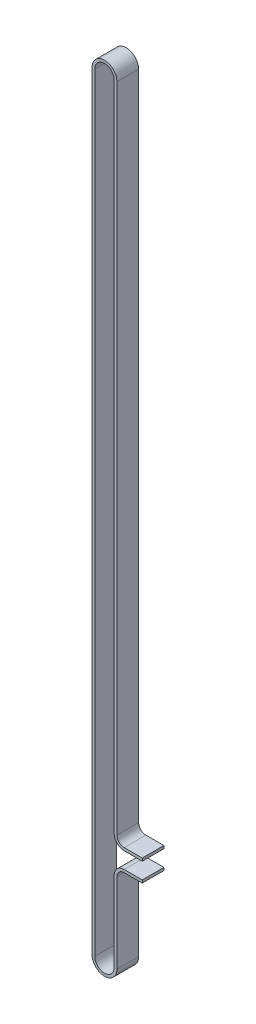
ISO-10303-21;
HEADER;
FILE_DESCRIPTION(('STEP AP214'),'2;1');
FILE_NAME('part.step','',(''),(''),'','','');
FILE_SCHEMA(('AUTOMOTIVE_DESIGN { 1 0 10303 214 1 1 1 1 }'));
ENDSEC;
DATA;
#1=APPLICATION_CONTEXT('core data for automotive mechanical design processes');
#2=APPLICATION_PROTOCOL_DEFINITION('international standard','automotive_design',2000,#1);
#3=PRODUCT_CONTEXT('',#1,'mechanical');
#4=PRODUCT('Part','Part','',(#3));
#5=PRODUCT_RELATED_PRODUCT_CATEGORY('part','',(#4));
#6=PRODUCT_DEFINITION_FORMATION('','',#4);
#7=PRODUCT_DEFINITION_CONTEXT('part definition',#1,'design');
#8=PRODUCT_DEFINITION('design','',#6,#7);
#9=PRODUCT_DEFINITION_SHAPE('','',#8);
#10=(LENGTH_UNIT() NAMED_UNIT(*) SI_UNIT(.MILLI.,.METRE.));
#11=(NAMED_UNIT(*) PLANE_ANGLE_UNIT() SI_UNIT($,.RADIAN.));
#12=(NAMED_UNIT(*) SI_UNIT($,.STERADIAN.) SOLID_ANGLE_UNIT());
#13=UNCERTAINTY_MEASURE_WITH_UNIT(LENGTH_MEASURE(1.E-05),#10,'distance_accuracy_value','');
#14=(GEOMETRIC_REPRESENTATION_CONTEXT(3) GLOBAL_UNCERTAINTY_ASSIGNED_CONTEXT((#13)) GLOBAL_UNIT_ASSIGNED_CONTEXT((#10,
#11,#12)) REPRESENTATION_CONTEXT('',''));
#15=CARTESIAN_POINT('',(0.,0.,0.));
#16=DIRECTION('',(0.,0.,1.));
#17=DIRECTION('',(1.,0.,0.));
#18=AXIS2_PLACEMENT_3D('',#15,#16,#17);
#19=CARTESIAN_POINT('',(10.881,-366.32,12.));
#20=DIRECTION('',(0.,1.,0.));
#21=DIRECTION('',(-1.,0.,0.));
#22=AXIS2_PLACEMENT_3D('',#19,#20,#21);
#23=PLANE('',#22);
#24=DIRECTION('',(1.,0.,0.));
#25=VECTOR('',#24,1.);
#26=CARTESIAN_POINT('',(10.881,-366.32,0.));
#27=LINE('',#26,#25);
#28=CARTESIAN_POINT('',(10.881,-366.32,0.));
#29=VERTEX_POINT('',#28);
#30=CARTESIAN_POINT('',(20.881,-366.32,0.));
#31=VERTEX_POINT('',#30);
#32=EDGE_CURVE('E206',#29,#31,#27,.T.);
#33=ORIENTED_EDGE('',*,*,#32,.T.);
#34=DIRECTION('',(0.,0.,-1.));
#35=VECTOR('',#34,1.);
#36=CARTESIAN_POINT('',(20.881,-366.32,12.));
#37=LINE('',#36,#35);
#38=CARTESIAN_POINT('',(20.881,-366.32,12.));
#39=VERTEX_POINT('',#38);
#40=EDGE_CURVE('E11',#39,#31,#37,.T.);
#41=ORIENTED_EDGE('',*,*,#40,.F.);
#42=DIRECTION('',(1.,0.,0.));
#43=VECTOR('',#42,1.);
#44=CARTESIAN_POINT('',(10.881,-366.32,12.));
#45=LINE('',#44,#43);
#46=CARTESIAN_POINT('',(10.881,-366.32,12.));
#47=VERTEX_POINT('',#46);
#48=EDGE_CURVE('E131',#47,#39,#45,.T.);
#49=ORIENTED_EDGE('',*,*,#48,.F.);
#50=DIRECTION('',(0.,0.,-1.));
#51=VECTOR('',#50,1.);
#52=CARTESIAN_POINT('',(10.881,-366.32,12.));
#53=LINE('',#52,#51);
#54=EDGE_CURVE('E202',#47,#29,#53,.T.);
#55=ORIENTED_EDGE('',*,*,#54,.T.);
#56=EDGE_LOOP('',(#33,#41,#49,#55));
#57=FACE_BOUND('',#56,.T.);
#58=ADVANCED_FACE('F39',(#57),#23,.F.);
#59=CARTESIAN_POINT('',(20.881,-364.8,12.));
#60=DIRECTION('',(1.,0.,0.));
#61=DIRECTION('',(0.,1.,0.));
#62=AXIS2_PLACEMENT_3D('',#59,#60,#61);
#63=PLANE('',#62);
#64=DIRECTION('',(0.,-1.,0.));
#65=VECTOR('',#64,1.);
#66=CARTESIAN_POINT('',(20.881,-364.8,0.));
#67=LINE('',#66,#65);
#68=CARTESIAN_POINT('',(20.881,-364.8,0.));
#69=VERTEX_POINT('',#68);
#70=EDGE_CURVE('E209',#69,#31,#67,.T.);
#71=ORIENTED_EDGE('',*,*,#70,.F.);
#72=DIRECTION('',(0.,0.,-1.));
#73=VECTOR('',#72,1.);
#74=CARTESIAN_POINT('',(20.881,-364.8,12.));
#75=LINE('',#74,#73);
#76=CARTESIAN_POINT('',(20.881,-364.8,12.));
#77=VERTEX_POINT('',#76);
#78=EDGE_CURVE('E47',#77,#69,#75,.T.);
#79=ORIENTED_EDGE('',*,*,#78,.F.);
#80=DIRECTION('',(0.,-1.,0.));
#81=VECTOR('',#80,1.);
#82=CARTESIAN_POINT('',(20.881,-364.8,12.));
#83=LINE('',#82,#81);
#84=EDGE_CURVE('E311',#77,#39,#83,.T.);
#85=ORIENTED_EDGE('',*,*,#84,.T.);
#86=ORIENTED_EDGE('',*,*,#40,.T.);
#87=EDGE_LOOP('',(#71,#79,#85,#86));
#88=FACE_BOUND('',#87,.T.);
#89=ADVANCED_FACE('F298',(#88),#63,.T.);
#90=CARTESIAN_POINT('',(10.881,-364.8,12.));
#91=DIRECTION('',(0.,1.,0.));
#92=DIRECTION('',(-1.,0.,0.));
#93=AXIS2_PLACEMENT_3D('',#90,#91,#92);
#94=PLANE('',#93);
#95=DIRECTION('',(1.,0.,0.));
#96=VECTOR('',#95,1.);
#97=CARTESIAN_POINT('',(10.881,-364.8,0.));
#98=LINE('',#97,#96);
#99=CARTESIAN_POINT('',(10.881,-364.8,0.));
#100=VERTEX_POINT('',#99);
#101=EDGE_CURVE('E212',#100,#69,#98,.T.);
#102=ORIENTED_EDGE('',*,*,#101,.F.);
#103=DIRECTION('',(0.,0.,-1.));
#104=VECTOR('',#103,1.);
#105=CARTESIAN_POINT('',(10.881,-364.8,12.));
#106=LINE('',#105,#104);
#107=CARTESIAN_POINT('',(10.881,-364.8,12.));
#108=VERTEX_POINT('',#107);
#109=EDGE_CURVE('E288',#108,#100,#106,.T.);
#110=ORIENTED_EDGE('',*,*,#109,.F.);
#111=DIRECTION('',(1.,0.,0.));
#112=VECTOR('',#111,1.);
#113=CARTESIAN_POINT('',(10.881,-364.8,12.));
#114=LINE('',#113,#112);
#115=EDGE_CURVE('E295',#108,#77,#114,.T.);
#116=ORIENTED_EDGE('',*,*,#115,.T.);
#117=ORIENTED_EDGE('',*,*,#78,.T.);
#118=EDGE_LOOP('',(#102,#110,#116,#117));
#119=FACE_BOUND('',#118,.T.);
#120=ADVANCED_FACE('F293',(#119),#94,.T.);
#121=CARTESIAN_POINT('',(10.881,-360.8,12.));
#122=DIRECTION('',(0.,0.,-1.));
#123=DIRECTION('',(-1.,0.,0.));
#124=AXIS2_PLACEMENT_3D('',#121,#122,#123);
#125=CYLINDRICAL_SURFACE('',#124,4.00000000000001);
#126=CARTESIAN_POINT('',(10.881,-360.8,0.));
#127=DIRECTION('',(0.,0.,1.));
#128=DIRECTION('',(1.,0.,0.));
#129=AXIS2_PLACEMENT_3D('',#126,#127,#128);
#130=CIRCLE('',#129,4.00000000000001);
#131=CARTESIAN_POINT('',(6.88099999999999,-360.8,0.));
#132=VERTEX_POINT('',#131);
#133=EDGE_CURVE('E215',#132,#100,#130,.T.);
#134=ORIENTED_EDGE('',*,*,#133,.F.);
#135=DIRECTION('',(0.,0.,-1.));
#136=VECTOR('',#135,1.);
#137=CARTESIAN_POINT('',(6.88099999999999,-360.8,12.));
#138=LINE('',#137,#136);
#139=CARTESIAN_POINT('',(6.88099999999999,-360.8,12.));
#140=VERTEX_POINT('',#139);
#141=EDGE_CURVE('E286',#140,#132,#138,.T.);
#142=ORIENTED_EDGE('',*,*,#141,.F.);
#143=CARTESIAN_POINT('',(10.881,-360.8,12.));
#144=DIRECTION('',(0.,0.,1.));
#145=DIRECTION('',(1.,0.,0.));
#146=AXIS2_PLACEMENT_3D('',#143,#144,#145);
#147=CIRCLE('',#146,4.00000000000001);
#148=EDGE_CURVE('E308',#140,#108,#147,.T.);
#149=ORIENTED_EDGE('',*,*,#148,.T.);
#150=ORIENTED_EDGE('',*,*,#109,.T.);
#151=EDGE_LOOP('',(#134,#142,#149,#150));
#152=FACE_BOUND('',#151,.T.);
#153=ADVANCED_FACE('F305',(#152),#125,.F.);
#154=CARTESIAN_POINT('',(6.881,-360.8,12.));
#155=DIRECTION('',(1.,0.,0.));
#156=DIRECTION('',(0.,0.,-1.));
#157=AXIS2_PLACEMENT_3D('',#154,#155,#156);
#158=PLANE('',#157);
#159=DIRECTION('',(0.,1.,0.));
#160=VECTOR('',#159,1.);
#161=CARTESIAN_POINT('',(6.881,-360.8,0.));
#162=LINE('',#161,#160);
#163=CARTESIAN_POINT('',(6.881,0.,0.));
#164=VERTEX_POINT('',#163);
#165=EDGE_CURVE('E218',#164,#132,#162,.F.);
#166=ORIENTED_EDGE('',*,*,#165,.F.);
#167=DIRECTION('',(0.,0.,-1.));
#168=VECTOR('',#167,1.);
#169=CARTESIAN_POINT('',(6.881,0.,12.));
#170=LINE('',#169,#168);
#171=CARTESIAN_POINT('',(6.881,0.,12.));
#172=VERTEX_POINT('',#171);
#173=EDGE_CURVE('E284',#172,#164,#170,.T.);
#174=ORIENTED_EDGE('',*,*,#173,.F.);
#175=DIRECTION('',(0.,1.,0.));
#176=VECTOR('',#175,1.);
#177=CARTESIAN_POINT('',(6.881,-360.8,12.));
#178=LINE('',#177,#176);
#179=EDGE_CURVE('E313',#172,#140,#178,.F.);
#180=ORIENTED_EDGE('',*,*,#179,.T.);
#181=ORIENTED_EDGE('',*,*,#141,.T.);
#182=EDGE_LOOP('',(#166,#174,#180,#181));
#183=FACE_BOUND('',#182,.T.);
#184=ADVANCED_FACE('F379',(#183),#158,.T.);
#185=CARTESIAN_POINT('',(0.,0.,12.));
#186=DIRECTION('',(0.,0.,-1.));
#187=DIRECTION('',(-1.,0.,0.));
#188=AXIS2_PLACEMENT_3D('',#185,#186,#187);
#189=CYLINDRICAL_SURFACE('',#188,6.881);
#190=CARTESIAN_POINT('',(0.,0.,0.));
#191=DIRECTION('',(0.,0.,1.));
#192=DIRECTION('',(1.,0.,0.));
#193=AXIS2_PLACEMENT_3D('',#190,#191,#192);
#194=CIRCLE('',#193,6.881);
#195=CARTESIAN_POINT('',(-6.881,0.,0.));
#196=VERTEX_POINT('',#195);
#197=EDGE_CURVE('E221',#196,#164,#194,.F.);
#198=ORIENTED_EDGE('',*,*,#197,.F.);
#199=DIRECTION('',(0.,0.,-1.));
#200=VECTOR('',#199,1.);
#201=CARTESIAN_POINT('',(-6.881,0.,12.));
#202=LINE('',#201,#200);
#203=CARTESIAN_POINT('',(-6.881,0.,12.));
#204=VERTEX_POINT('',#203);
#205=EDGE_CURVE('E282',#204,#196,#202,.T.);
#206=ORIENTED_EDGE('',*,*,#205,.F.);
#207=CARTESIAN_POINT('',(0.,0.,12.));
#208=DIRECTION('',(0.,0.,1.));
#209=DIRECTION('',(1.,0.,0.));
#210=AXIS2_PLACEMENT_3D('',#207,#208,#209);
#211=CIRCLE('',#210,6.881);
#212=EDGE_CURVE('E319',#204,#172,#211,.F.);
#213=ORIENTED_EDGE('',*,*,#212,.T.);
#214=ORIENTED_EDGE('',*,*,#173,.T.);
#215=EDGE_LOOP('',(#198,#206,#213,#214));
#216=FACE_BOUND('',#215,.T.);
#217=ADVANCED_FACE('F382',(#216),#189,.T.);
#218=CARTESIAN_POINT('',(-6.881,0.,12.));
#219=DIRECTION('',(-1.,0.,0.));
#220=DIRECTION('',(0.,0.,1.));
#221=AXIS2_PLACEMENT_3D('',#218,#219,#220);
#222=PLANE('',#221);
#223=DIRECTION('',(0.,1.,0.));
#224=VECTOR('',#223,1.);
#225=CARTESIAN_POINT('',(-6.881,0.,0.));
#226=LINE('',#225,#224);
#227=CARTESIAN_POINT('',(-6.881,-425.,0.));
#228=VERTEX_POINT('',#227);
#229=EDGE_CURVE('E224',#228,#196,#226,.T.);
#230=ORIENTED_EDGE('',*,*,#229,.F.);
#231=DIRECTION('',(0.,0.,-1.));
#232=VECTOR('',#231,1.);
#233=CARTESIAN_POINT('',(-6.881,-425.,12.));
#234=LINE('',#233,#232);
#235=CARTESIAN_POINT('',(-6.881,-425.,12.));
#236=VERTEX_POINT('',#235);
#237=EDGE_CURVE('E280',#236,#228,#234,.T.);
#238=ORIENTED_EDGE('',*,*,#237,.F.);
#239=DIRECTION('',(0.,1.,0.));
#240=VECTOR('',#239,1.);
#241=CARTESIAN_POINT('',(-6.881,0.,12.));
#242=LINE('',#241,#240);
#243=EDGE_CURVE('E322',#236,#204,#242,.T.);
#244=ORIENTED_EDGE('',*,*,#243,.T.);
#245=ORIENTED_EDGE('',*,*,#205,.T.);
#246=EDGE_LOOP('',(#230,#238,#244,#245));
#247=FACE_BOUND('',#246,.T.);
#248=ADVANCED_FACE('F386',(#247),#222,.T.);
#249=CARTESIAN_POINT('',(0.,-425.,12.));
#250=DIRECTION('',(0.,0.,-1.));
#251=DIRECTION('',(-1.,0.,0.));
#252=AXIS2_PLACEMENT_3D('',#249,#250,#251);
#253=CYLINDRICAL_SURFACE('',#252,6.881);
#254=CARTESIAN_POINT('',(0.,-425.,0.));
#255=DIRECTION('',(0.,0.,1.));
#256=DIRECTION('',(1.,0.,0.));
#257=AXIS2_PLACEMENT_3D('',#254,#255,#256);
#258=CIRCLE('',#257,6.881);
#259=CARTESIAN_POINT('',(6.881,-425.,0.));
#260=VERTEX_POINT('',#259);
#261=EDGE_CURVE('E227',#260,#228,#258,.F.);
#262=ORIENTED_EDGE('',*,*,#261,.F.);
#263=DIRECTION('',(0.,0.,-1.));
#264=VECTOR('',#263,1.);
#265=CARTESIAN_POINT('',(6.881,-425.,12.));
#266=LINE('',#265,#264);
#267=CARTESIAN_POINT('',(6.881,-425.,12.));
#268=VERTEX_POINT('',#267);
#269=EDGE_CURVE('E278',#268,#260,#266,.T.);
#270=ORIENTED_EDGE('',*,*,#269,.F.);
#271=CARTESIAN_POINT('',(0.,-425.,12.));
#272=DIRECTION('',(0.,0.,1.));
#273=DIRECTION('',(1.,0.,0.));
#274=AXIS2_PLACEMENT_3D('',#271,#272,#273);
#275=CIRCLE('',#274,6.881);
#276=EDGE_CURVE('E325',#268,#236,#275,.F.);
#277=ORIENTED_EDGE('',*,*,#276,.T.);
#278=ORIENTED_EDGE('',*,*,#237,.T.);
#279=EDGE_LOOP('',(#262,#270,#277,#278));
#280=FACE_BOUND('',#279,.T.);
#281=ADVANCED_FACE('F390',(#280),#253,.T.);
#282=CARTESIAN_POINT('',(6.88099999999999,-425.,12.));
#283=DIRECTION('',(1.,0.,0.));
#284=DIRECTION('',(0.,1.,0.));
#285=AXIS2_PLACEMENT_3D('',#282,#283,#284);
#286=PLANE('',#285);
#287=DIRECTION('',(0.,-1.,0.));
#288=VECTOR('',#287,1.);
#289=CARTESIAN_POINT('',(6.88099999999999,-425.,0.));
#290=LINE('',#289,#288);
#291=CARTESIAN_POINT('',(6.881,-380.8,0.));
#292=VERTEX_POINT('',#291);
#293=EDGE_CURVE('E230',#292,#260,#290,.T.);
#294=ORIENTED_EDGE('',*,*,#293,.F.);
#295=DIRECTION('',(0.,0.,-1.));
#296=VECTOR('',#295,1.);
#297=CARTESIAN_POINT('',(6.881,-380.8,12.));
#298=LINE('',#297,#296);
#299=CARTESIAN_POINT('',(6.881,-380.8,12.));
#300=VERTEX_POINT('',#299);
#301=EDGE_CURVE('E276',#300,#292,#298,.T.);
#302=ORIENTED_EDGE('',*,*,#301,.F.);
#303=DIRECTION('',(0.,-1.,0.));
#304=VECTOR('',#303,1.);
#305=CARTESIAN_POINT('',(6.88099999999999,-425.,12.));
#306=LINE('',#305,#304);
#307=EDGE_CURVE('E328',#300,#268,#306,.T.);
#308=ORIENTED_EDGE('',*,*,#307,.T.);
#309=ORIENTED_EDGE('',*,*,#269,.T.);
#310=EDGE_LOOP('',(#294,#302,#308,#309));
#311=FACE_BOUND('',#310,.T.);
#312=ADVANCED_FACE('F394',(#311),#286,.T.);
#313=CARTESIAN_POINT('',(10.881,-380.8,12.));
#314=DIRECTION('',(0.,0.,-1.));
#315=DIRECTION('',(-1.,0.,0.));
#316=AXIS2_PLACEMENT_3D('',#313,#314,#315);
#317=CYLINDRICAL_SURFACE('',#316,4.00000000000001);
#318=CARTESIAN_POINT('',(10.881,-380.8,0.));
#319=DIRECTION('',(0.,0.,1.));
#320=DIRECTION('',(1.,0.,0.));
#321=AXIS2_PLACEMENT_3D('',#318,#319,#320);
#322=CIRCLE('',#321,4.00000000000001);
#323=CARTESIAN_POINT('',(10.881,-376.8,0.));
#324=VERTEX_POINT('',#323);
#325=EDGE_CURVE('E233',#324,#292,#322,.T.);
#326=ORIENTED_EDGE('',*,*,#325,.F.);
#327=DIRECTION('',(0.,0.,-1.));
#328=VECTOR('',#327,1.);
#329=CARTESIAN_POINT('',(10.881,-376.8,12.));
#330=LINE('',#329,#328);
#331=CARTESIAN_POINT('',(10.881,-376.8,12.));
#332=VERTEX_POINT('',#331);
#333=EDGE_CURVE('E274',#332,#324,#330,.T.);
#334=ORIENTED_EDGE('',*,*,#333,.F.);
#335=CARTESIAN_POINT('',(10.881,-380.8,12.));
#336=DIRECTION('',(0.,0.,1.));
#337=DIRECTION('',(1.,0.,0.));
#338=AXIS2_PLACEMENT_3D('',#335,#336,#337);
#339=CIRCLE('',#338,4.00000000000001);
#340=EDGE_CURVE('E331',#332,#300,#339,.T.);
#341=ORIENTED_EDGE('',*,*,#340,.T.);
#342=ORIENTED_EDGE('',*,*,#301,.T.);
#343=EDGE_LOOP('',(#326,#334,#341,#342));
#344=FACE_BOUND('',#343,.T.);
#345=ADVANCED_FACE('F398',(#344),#317,.F.);
#346=CARTESIAN_POINT('',(10.881,-376.8,12.));
#347=DIRECTION('',(0.,-1.,0.));
#348=DIRECTION('',(1.,0.,0.));
#349=AXIS2_PLACEMENT_3D('',#346,#347,#348);
#350=PLANE('',#349);
#351=DIRECTION('',(-1.,0.,0.));
#352=VECTOR('',#351,1.);
#353=CARTESIAN_POINT('',(10.881,-376.8,0.));
#354=LINE('',#353,#352);
#355=CARTESIAN_POINT('',(20.881,-376.8,0.));
#356=VERTEX_POINT('',#355);
#357=EDGE_CURVE('E236',#356,#324,#354,.T.);
#358=ORIENTED_EDGE('',*,*,#357,.F.);
#359=DIRECTION('',(0.,0.,-1.));
#360=VECTOR('',#359,1.);
#361=CARTESIAN_POINT('',(20.881,-376.8,12.));
#362=LINE('',#361,#360);
#363=CARTESIAN_POINT('',(20.881,-376.8,12.));
#364=VERTEX_POINT('',#363);
#365=EDGE_CURVE('E272',#364,#356,#362,.T.);
#366=ORIENTED_EDGE('',*,*,#365,.F.);
#367=DIRECTION('',(-1.,0.,0.));
#368=VECTOR('',#367,1.);
#369=CARTESIAN_POINT('',(10.881,-376.8,12.));
#370=LINE('',#369,#368);
#371=EDGE_CURVE('E334',#364,#332,#370,.T.);
#372=ORIENTED_EDGE('',*,*,#371,.T.);
#373=ORIENTED_EDGE('',*,*,#333,.T.);
#374=EDGE_LOOP('',(#358,#366,#372,#373));
#375=FACE_BOUND('',#374,.T.);
#376=ADVANCED_FACE('F402',(#375),#350,.T.);
#377=CARTESIAN_POINT('',(20.881,-375.28,12.));
#378=DIRECTION('',(1.,0.,0.));
#379=DIRECTION('',(0.,1.,0.));
#380=AXIS2_PLACEMENT_3D('',#377,#378,#379);
#381=PLANE('',#380);
#382=DIRECTION('',(0.,-1.,0.));
#383=VECTOR('',#382,1.);
#384=CARTESIAN_POINT('',(20.881,-375.28,0.));
#385=LINE('',#384,#383);
#386=CARTESIAN_POINT('',(20.881,-375.28,0.));
#387=VERTEX_POINT('',#386);
#388=EDGE_CURVE('E239',#387,#356,#385,.T.);
#389=ORIENTED_EDGE('',*,*,#388,.F.);
#390=DIRECTION('',(0.,0.,-1.));
#391=VECTOR('',#390,1.);
#392=CARTESIAN_POINT('',(20.881,-375.28,12.));
#393=LINE('',#392,#391);
#394=CARTESIAN_POINT('',(20.881,-375.28,12.));
#395=VERTEX_POINT('',#394);
#396=EDGE_CURVE('E270',#395,#387,#393,.T.);
#397=ORIENTED_EDGE('',*,*,#396,.F.);
#398=DIRECTION('',(0.,-1.,0.));
#399=VECTOR('',#398,1.);
#400=CARTESIAN_POINT('',(20.881,-375.28,12.));
#401=LINE('',#400,#399);
#402=EDGE_CURVE('E337',#395,#364,#401,.T.);
#403=ORIENTED_EDGE('',*,*,#402,.T.);
#404=ORIENTED_EDGE('',*,*,#365,.T.);
#405=EDGE_LOOP('',(#389,#397,#403,#404));
#406=FACE_BOUND('',#405,.T.);
#407=ADVANCED_FACE('F406',(#406),#381,.T.);
#408=CARTESIAN_POINT('',(10.881,-375.28,12.));
#409=DIRECTION('',(0.,-1.,0.));
#410=DIRECTION('',(1.,0.,0.));
#411=AXIS2_PLACEMENT_3D('',#408,#409,#410);
#412=PLANE('',#411);
#413=DIRECTION('',(-1.,0.,0.));
#414=VECTOR('',#413,1.);
#415=CARTESIAN_POINT('',(10.881,-375.28,0.));
#416=LINE('',#415,#414);
#417=CARTESIAN_POINT('',(10.881,-375.28,0.));
#418=VERTEX_POINT('',#417);
#419=EDGE_CURVE('E242',#387,#418,#416,.T.);
#420=ORIENTED_EDGE('',*,*,#419,.T.);
#421=DIRECTION('',(0.,0.,-1.));
#422=VECTOR('',#421,1.);
#423=CARTESIAN_POINT('',(10.881,-375.28,12.));
#424=LINE('',#423,#422);
#425=CARTESIAN_POINT('',(10.881,-375.28,12.));
#426=VERTEX_POINT('',#425);
#427=EDGE_CURVE('E267',#426,#418,#424,.T.);
#428=ORIENTED_EDGE('',*,*,#427,.F.);
#429=DIRECTION('',(-1.,0.,0.));
#430=VECTOR('',#429,1.);
#431=CARTESIAN_POINT('',(10.881,-375.28,12.));
#432=LINE('',#431,#430);
#433=EDGE_CURVE('E340',#395,#426,#432,.T.);
#434=ORIENTED_EDGE('',*,*,#433,.F.);
#435=ORIENTED_EDGE('',*,*,#396,.T.);
#436=EDGE_LOOP('',(#420,#428,#434,#435));
#437=FACE_BOUND('',#436,.T.);
#438=ADVANCED_FACE('F410',(#437),#412,.F.);
#439=CARTESIAN_POINT('',(10.881,-380.8,12.));
#440=DIRECTION('',(0.,0.,-1.));
#441=DIRECTION('',(-1.,0.,0.));
#442=AXIS2_PLACEMENT_3D('',#439,#440,#441);
#443=CYLINDRICAL_SURFACE('',#442,5.52000000000001);
#444=CARTESIAN_POINT('',(10.881,-380.8,0.));
#445=DIRECTION('',(0.,0.,1.));
#446=DIRECTION('',(1.,0.,0.));
#447=AXIS2_PLACEMENT_3D('',#444,#445,#446);
#448=CIRCLE('',#447,5.52000000000001);
#449=CARTESIAN_POINT('',(5.361,-380.8,0.));
#450=VERTEX_POINT('',#449);
#451=EDGE_CURVE('E244',#418,#450,#448,.T.);
#452=ORIENTED_EDGE('',*,*,#451,.T.);
#453=DIRECTION('',(0.,0.,-1.));
#454=VECTOR('',#453,1.);
#455=CARTESIAN_POINT('',(5.361,-380.8,12.));
#456=LINE('',#455,#454);
#457=CARTESIAN_POINT('',(5.361,-380.8,12.));
#458=VERTEX_POINT('',#457);
#459=EDGE_CURVE('E264',#458,#450,#456,.T.);
#460=ORIENTED_EDGE('',*,*,#459,.F.);
#461=CARTESIAN_POINT('',(10.881,-380.8,12.));
#462=DIRECTION('',(0.,0.,1.));
#463=DIRECTION('',(1.,0.,0.));
#464=AXIS2_PLACEMENT_3D('',#461,#462,#463);
#465=CIRCLE('',#464,5.52000000000001);
#466=EDGE_CURVE('E342',#426,#458,#465,.T.);
#467=ORIENTED_EDGE('',*,*,#466,.F.);
#468=ORIENTED_EDGE('',*,*,#427,.T.);
#469=EDGE_LOOP('',(#452,#460,#467,#468));
#470=FACE_BOUND('',#469,.T.);
#471=ADVANCED_FACE('F414',(#470),#443,.T.);
#472=CARTESIAN_POINT('',(5.36099999999999,-425.,12.));
#473=DIRECTION('',(1.,0.,0.));
#474=DIRECTION('',(0.,1.,0.));
#475=AXIS2_PLACEMENT_3D('',#472,#473,#474);
#476=PLANE('',#475);
#477=DIRECTION('',(0.,-1.,0.));
#478=VECTOR('',#477,1.);
#479=CARTESIAN_POINT('',(5.36099999999999,-425.,0.));
#480=LINE('',#479,#478);
#481=CARTESIAN_POINT('',(5.361,-425.,0.));
#482=VERTEX_POINT('',#481);
#483=EDGE_CURVE('E246',#450,#482,#480,.T.);
#484=ORIENTED_EDGE('',*,*,#483,.T.);
#485=DIRECTION('',(0.,0.,-1.));
#486=VECTOR('',#485,1.);
#487=CARTESIAN_POINT('',(5.361,-425.,12.));
#488=LINE('',#487,#486);
#489=CARTESIAN_POINT('',(5.361,-425.,12.));
#490=VERTEX_POINT('',#489);
#491=EDGE_CURVE('E261',#490,#482,#488,.T.);
#492=ORIENTED_EDGE('',*,*,#491,.F.);
#493=DIRECTION('',(0.,-1.,0.));
#494=VECTOR('',#493,1.);
#495=CARTESIAN_POINT('',(5.36099999999999,-425.,12.));
#496=LINE('',#495,#494);
#497=EDGE_CURVE('E344',#458,#490,#496,.T.);
#498=ORIENTED_EDGE('',*,*,#497,.F.);
#499=ORIENTED_EDGE('',*,*,#459,.T.);
#500=EDGE_LOOP('',(#484,#492,#498,#499));
#501=FACE_BOUND('',#500,.T.);
#502=ADVANCED_FACE('F418',(#501),#476,.F.);
#503=CARTESIAN_POINT('',(0.,-425.,12.));
#504=DIRECTION('',(0.,0.,-1.));
#505=DIRECTION('',(-1.,0.,0.));
#506=AXIS2_PLACEMENT_3D('',#503,#504,#505);
#507=CYLINDRICAL_SURFACE('',#506,5.361);
#508=CARTESIAN_POINT('',(0.,-425.,0.));
#509=DIRECTION('',(0.,0.,1.));
#510=DIRECTION('',(1.,0.,0.));
#511=AXIS2_PLACEMENT_3D('',#508,#509,#510);
#512=CIRCLE('',#511,5.361);
#513=CARTESIAN_POINT('',(-5.361,-425.,0.));
#514=VERTEX_POINT('',#513);
#515=EDGE_CURVE('E248',#482,#514,#512,.F.);
#516=ORIENTED_EDGE('',*,*,#515,.T.);
#517=DIRECTION('',(0.,0.,-1.));
#518=VECTOR('',#517,1.);
#519=CARTESIAN_POINT('',(-5.361,-425.,12.));
#520=LINE('',#519,#518);
#521=CARTESIAN_POINT('',(-5.361,-425.,12.));
#522=VERTEX_POINT('',#521);
#523=EDGE_CURVE('E258',#522,#514,#520,.T.);
#524=ORIENTED_EDGE('',*,*,#523,.F.);
#525=CARTESIAN_POINT('',(0.,-425.,12.));
#526=DIRECTION('',(0.,0.,1.));
#527=DIRECTION('',(1.,0.,0.));
#528=AXIS2_PLACEMENT_3D('',#525,#526,#527);
#529=CIRCLE('',#528,5.361);
#530=EDGE_CURVE('E346',#490,#522,#529,.F.);
#531=ORIENTED_EDGE('',*,*,#530,.F.);
#532=ORIENTED_EDGE('',*,*,#491,.T.);
#533=EDGE_LOOP('',(#516,#524,#531,#532));
#534=FACE_BOUND('',#533,.T.);
#535=ADVANCED_FACE('F352',(#534),#507,.F.);
#536=CARTESIAN_POINT('',(-5.361,0.,12.));
#537=DIRECTION('',(-1.,0.,0.));
#538=DIRECTION('',(0.,0.,1.));
#539=AXIS2_PLACEMENT_3D('',#536,#537,#538);
#540=PLANE('',#539);
#541=DIRECTION('',(0.,1.,0.));
#542=VECTOR('',#541,1.);
#543=CARTESIAN_POINT('',(-5.361,0.,0.));
#544=LINE('',#543,#542);
#545=CARTESIAN_POINT('',(-5.361,0.,0.));
#546=VERTEX_POINT('',#545);
#547=EDGE_CURVE('E250',#514,#546,#544,.T.);
#548=ORIENTED_EDGE('',*,*,#547,.T.);
#549=DIRECTION('',(0.,0.,-1.));
#550=VECTOR('',#549,1.);
#551=CARTESIAN_POINT('',(-5.361,0.,12.));
#552=LINE('',#551,#550);
#553=CARTESIAN_POINT('',(-5.361,0.,12.));
#554=VERTEX_POINT('',#553);
#555=EDGE_CURVE('E197',#554,#546,#552,.T.);
#556=ORIENTED_EDGE('',*,*,#555,.F.);
#557=DIRECTION('',(0.,1.,0.));
#558=VECTOR('',#557,1.);
#559=CARTESIAN_POINT('',(-5.361,0.,12.));
#560=LINE('',#559,#558);
#561=EDGE_CURVE('E188',#522,#554,#560,.T.);
#562=ORIENTED_EDGE('',*,*,#561,.F.);
#563=ORIENTED_EDGE('',*,*,#523,.T.);
#564=EDGE_LOOP('',(#548,#556,#562,#563));
#565=FACE_BOUND('',#564,.T.);
#566=ADVANCED_FACE('F356',(#565),#540,.F.);
#567=CARTESIAN_POINT('',(0.,0.,12.));
#568=DIRECTION('',(0.,0.,-1.));
#569=DIRECTION('',(-1.,0.,0.));
#570=AXIS2_PLACEMENT_3D('',#567,#568,#569);
#571=CYLINDRICAL_SURFACE('',#570,5.361);
#572=CARTESIAN_POINT('',(0.,0.,0.));
#573=DIRECTION('',(0.,0.,1.));
#574=DIRECTION('',(1.,0.,0.));
#575=AXIS2_PLACEMENT_3D('',#572,#573,#574);
#576=CIRCLE('',#575,5.361);
#577=CARTESIAN_POINT('',(5.361,0.,0.));
#578=VERTEX_POINT('',#577);
#579=EDGE_CURVE('E196',#546,#578,#576,.F.);
#580=ORIENTED_EDGE('',*,*,#579,.T.);
#581=DIRECTION('',(0.,0.,-1.));
#582=VECTOR('',#581,1.);
#583=CARTESIAN_POINT('',(5.361,0.,12.));
#584=LINE('',#583,#582);
#585=CARTESIAN_POINT('',(5.361,0.,12.));
#586=VERTEX_POINT('',#585);
#587=EDGE_CURVE('E193',#586,#578,#584,.T.);
#588=ORIENTED_EDGE('',*,*,#587,.F.);
#589=CARTESIAN_POINT('',(0.,0.,12.));
#590=DIRECTION('',(0.,0.,1.));
#591=DIRECTION('',(1.,0.,0.));
#592=AXIS2_PLACEMENT_3D('',#589,#590,#591);
#593=CIRCLE('',#592,5.361);
#594=EDGE_CURVE('E182',#554,#586,#593,.F.);
#595=ORIENTED_EDGE('',*,*,#594,.F.);
#596=ORIENTED_EDGE('',*,*,#555,.T.);
#597=EDGE_LOOP('',(#580,#588,#595,#596));
#598=FACE_BOUND('',#597,.T.);
#599=ADVANCED_FACE('F194',(#598),#571,.F.);
#600=CARTESIAN_POINT('',(5.361,-360.8,12.));
#601=DIRECTION('',(1.,0.,0.));
#602=DIRECTION('',(0.,0.,-1.));
#603=AXIS2_PLACEMENT_3D('',#600,#601,#602);
#604=PLANE('',#603);
#605=DIRECTION('',(0.,1.,0.));
#606=VECTOR('',#605,1.);
#607=CARTESIAN_POINT('',(5.361,-360.8,0.));
#608=LINE('',#607,#606);
#609=CARTESIAN_POINT('',(5.36099999999999,-360.8,0.));
#610=VERTEX_POINT('',#609);
#611=EDGE_CURVE('E119',#578,#610,#608,.F.);
#612=ORIENTED_EDGE('',*,*,#611,.T.);
#613=DIRECTION('',(0.,0.,-1.));
#614=VECTOR('',#613,1.);
#615=CARTESIAN_POINT('',(5.36099999999999,-360.8,12.));
#616=LINE('',#615,#614);
#617=CARTESIAN_POINT('',(5.36099999999999,-360.8,12.));
#618=VERTEX_POINT('',#617);
#619=EDGE_CURVE('E198',#618,#610,#616,.T.);
#620=ORIENTED_EDGE('',*,*,#619,.F.);
#621=DIRECTION('',(0.,1.,0.));
#622=VECTOR('',#621,1.);
#623=CARTESIAN_POINT('',(5.361,-360.8,12.));
#624=LINE('',#623,#622);
#625=EDGE_CURVE('E186',#586,#618,#624,.F.);
#626=ORIENTED_EDGE('',*,*,#625,.F.);
#627=ORIENTED_EDGE('',*,*,#587,.T.);
#628=EDGE_LOOP('',(#612,#620,#626,#627));
#629=FACE_BOUND('',#628,.T.);
#630=ADVANCED_FACE('F200',(#629),#604,.F.);
#631=CARTESIAN_POINT('',(10.881,-360.8,12.));
#632=DIRECTION('',(0.,0.,-1.));
#633=DIRECTION('',(-1.,0.,0.));
#634=AXIS2_PLACEMENT_3D('',#631,#632,#633);
#635=CYLINDRICAL_SURFACE('',#634,5.52000000000001);
#636=CARTESIAN_POINT('',(10.881,-360.8,0.));
#637=DIRECTION('',(0.,0.,1.));
#638=DIRECTION('',(1.,0.,0.));
#639=AXIS2_PLACEMENT_3D('',#636,#637,#638);
#640=CIRCLE('',#639,5.52000000000001);
#641=EDGE_CURVE('E125',#610,#29,#640,.T.);
#642=ORIENTED_EDGE('',*,*,#641,.T.);
#643=ORIENTED_EDGE('',*,*,#54,.F.);
#644=CARTESIAN_POINT('',(10.881,-360.8,12.));
#645=DIRECTION('',(0.,0.,1.));
#646=DIRECTION('',(1.,0.,0.));
#647=AXIS2_PLACEMENT_3D('',#644,#645,#646);
#648=CIRCLE('',#647,5.52000000000001);
#649=EDGE_CURVE('E55',#618,#47,#648,.T.);
#650=ORIENTED_EDGE('',*,*,#649,.F.);
#651=ORIENTED_EDGE('',*,*,#619,.T.);
#652=EDGE_LOOP('',(#642,#643,#650,#651));
#653=FACE_BOUND('',#652,.T.);
#654=ADVANCED_FACE('F358',(#653),#635,.T.);
#655=CARTESIAN_POINT('',(10.881,-360.8,12.));
#656=DIRECTION('',(0.,0.,1.));
#657=DIRECTION('',(1.,0.,0.));
#658=AXIS2_PLACEMENT_3D('',#655,#656,#657);
#659=PLANE('',#658);
#660=ORIENTED_EDGE('',*,*,#48,.T.);
#661=ORIENTED_EDGE('',*,*,#84,.F.);
#662=ORIENTED_EDGE('',*,*,#115,.F.);
#663=ORIENTED_EDGE('',*,*,#148,.F.);
#664=ORIENTED_EDGE('',*,*,#179,.F.);
#665=ORIENTED_EDGE('',*,*,#212,.F.);
#666=ORIENTED_EDGE('',*,*,#243,.F.);
#667=ORIENTED_EDGE('',*,*,#276,.F.);
#668=ORIENTED_EDGE('',*,*,#307,.F.);
#669=ORIENTED_EDGE('',*,*,#340,.F.);
#670=ORIENTED_EDGE('',*,*,#371,.F.);
#671=ORIENTED_EDGE('',*,*,#402,.F.);
#672=ORIENTED_EDGE('',*,*,#433,.T.);
#673=ORIENTED_EDGE('',*,*,#466,.T.);
#674=ORIENTED_EDGE('',*,*,#497,.T.);
#675=ORIENTED_EDGE('',*,*,#530,.T.);
#676=ORIENTED_EDGE('',*,*,#561,.T.);
#677=ORIENTED_EDGE('',*,*,#594,.T.);
#678=ORIENTED_EDGE('',*,*,#625,.T.);
#679=ORIENTED_EDGE('',*,*,#649,.T.);
#680=EDGE_LOOP('',(#660,#661,#662,#663,#664,#665,#666,#667,#668,#669,#670,#671,#672,#673,#674,
#675,#676,#677,#678,#679));
#681=FACE_BOUND('',#680,.T.);
#682=ADVANCED_FACE('F184',(#681),#659,.T.);
#683=CARTESIAN_POINT('',(10.881,-360.8,0.));
#684=DIRECTION('',(0.,0.,1.));
#685=DIRECTION('',(1.,0.,0.));
#686=AXIS2_PLACEMENT_3D('',#683,#684,#685);
#687=PLANE('',#686);
#688=ORIENTED_EDGE('',*,*,#32,.F.);
#689=ORIENTED_EDGE('',*,*,#641,.F.);
#690=ORIENTED_EDGE('',*,*,#611,.F.);
#691=ORIENTED_EDGE('',*,*,#579,.F.);
#692=ORIENTED_EDGE('',*,*,#547,.F.);
#693=ORIENTED_EDGE('',*,*,#515,.F.);
#694=ORIENTED_EDGE('',*,*,#483,.F.);
#695=ORIENTED_EDGE('',*,*,#451,.F.);
#696=ORIENTED_EDGE('',*,*,#419,.F.);
#697=ORIENTED_EDGE('',*,*,#388,.T.);
#698=ORIENTED_EDGE('',*,*,#357,.T.);
#699=ORIENTED_EDGE('',*,*,#325,.T.);
#700=ORIENTED_EDGE('',*,*,#293,.T.);
#701=ORIENTED_EDGE('',*,*,#261,.T.);
#702=ORIENTED_EDGE('',*,*,#229,.T.);
#703=ORIENTED_EDGE('',*,*,#197,.T.);
#704=ORIENTED_EDGE('',*,*,#165,.T.);
#705=ORIENTED_EDGE('',*,*,#133,.T.);
#706=ORIENTED_EDGE('',*,*,#101,.T.);
#707=ORIENTED_EDGE('',*,*,#70,.T.);
#708=EDGE_LOOP('',(#688,#689,#690,#691,#692,#693,#694,#695,#696,#697,#698,#699,#700,#701,#702,
#703,#704,#705,#706,#707));
#709=FACE_BOUND('',#708,.T.);
#710=ADVANCED_FACE('F301',(#709),#687,.F.);
#711=CLOSED_SHELL('',(#58,#89,#120,#153,#184,#217,#248,#281,#312,#345,#376,#407,#438,#471,#502,
#535,#566,#599,#630,#654,#682,#710));
#712=MANIFOLD_SOLID_BREP('B2',#711);
#713=ADVANCED_BREP_SHAPE_REPRESENTATION('',(#18,#712),#14);
#714=SHAPE_DEFINITION_REPRESENTATION(#9,#713);
ENDSEC;
END-ISO-10303-21;
